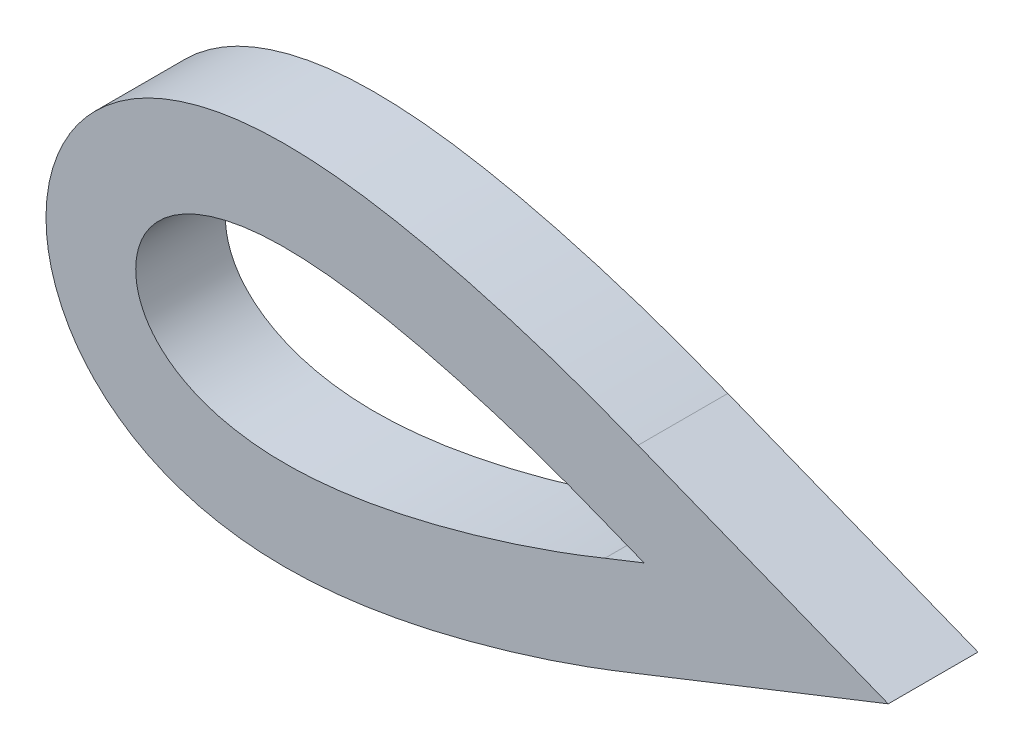
ISO-10303-21;
HEADER;
FILE_DESCRIPTION(('STEP AP214'),'2;1');
FILE_NAME('part.step','',(''),(''),'','','');
FILE_SCHEMA(('AUTOMOTIVE_DESIGN { 1 0 10303 214 1 1 1 1 }'));
ENDSEC;
DATA;
#1=APPLICATION_CONTEXT('core data for automotive mechanical design processes');
#2=APPLICATION_PROTOCOL_DEFINITION('international standard','automotive_design',2000,#1);
#3=PRODUCT_CONTEXT('',#1,'mechanical');
#4=PRODUCT('Part','Part','',(#3));
#5=PRODUCT_RELATED_PRODUCT_CATEGORY('part','',(#4));
#6=PRODUCT_DEFINITION_FORMATION('','',#4);
#7=PRODUCT_DEFINITION_CONTEXT('part definition',#1,'design');
#8=PRODUCT_DEFINITION('design','',#6,#7);
#9=PRODUCT_DEFINITION_SHAPE('','',#8);
#10=(LENGTH_UNIT() NAMED_UNIT(*) SI_UNIT(.MILLI.,.METRE.));
#11=(NAMED_UNIT(*) PLANE_ANGLE_UNIT() SI_UNIT($,.RADIAN.));
#12=(NAMED_UNIT(*) SI_UNIT($,.STERADIAN.) SOLID_ANGLE_UNIT());
#13=UNCERTAINTY_MEASURE_WITH_UNIT(LENGTH_MEASURE(1.E-05),#10,'distance_accuracy_value','');
#14=(GEOMETRIC_REPRESENTATION_CONTEXT(3) GLOBAL_UNCERTAINTY_ASSIGNED_CONTEXT((#13)) GLOBAL_UNIT_ASSIGNED_CONTEXT((#10,
#11,#12)) REPRESENTATION_CONTEXT('',''));
#15=CARTESIAN_POINT('',(0.,0.,0.));
#16=DIRECTION('',(0.,0.,1.));
#17=DIRECTION('',(1.,0.,0.));
#18=AXIS2_PLACEMENT_3D('',#15,#16,#17);
#19=CARTESIAN_POINT('',(-3.5,-2.80970992999618E-13,3.));
#20=DIRECTION('',(0.,0.,-1.));
#21=DIRECTION('',(-1.,0.,0.));
#22=AXIS2_PLACEMENT_3D('',#19,#20,#21);
#23=PLANE('',#22);
#24=CARTESIAN_POINT('',(16.2965398197559,3.30630723662,3.));
#25=CARTESIAN_POINT('',(15.6062531924938,3.58341900975374,3.));
#26=CARTESIAN_POINT('',(14.217393724142,4.1140687673244,3.));
#27=CARTESIAN_POINT('',(12.0871832129093,4.80366662805242,3.));
#28=CARTESIAN_POINT('',(9.91285023013423,5.39990504431122,3.));
#29=CARTESIAN_POINT('',(7.6390085054452,5.88049465242059,3.));
#30=CARTESIAN_POINT('',(5.57935945867602,6.12862814503999,3.));
#31=CARTESIAN_POINT('',(3.7684941194776,6.13276148095437,3.));
#32=CARTESIAN_POINT('',(2.30563580419767,5.98016909192922,3.));
#33=CARTESIAN_POINT('',(0.698738216382123,5.57222010036538,3.));
#34=CARTESIAN_POINT('',(-0.754528622780674,4.87235654903361,3.));
#35=CARTESIAN_POINT('',(-1.94046110921141,3.87862721868725,3.));
#36=CARTESIAN_POINT('',(-2.75980650550251,2.85449296540342,3.));
#37=CARTESIAN_POINT('',(-3.36876812159803,1.4729306089841,3.));
#38=CARTESIAN_POINT('',(-3.56561593920102,-2.85904112884428E-13,3.));
#39=CARTESIAN_POINT('',(-3.36876812159788,-1.47293060898463,3.));
#40=CARTESIAN_POINT('',(-2.75980650550221,-2.8544929654039,3.));
#41=CARTESIAN_POINT('',(-1.94046110921108,-3.87862721868758,3.));
#42=CARTESIAN_POINT('',(-0.75452862278034,-4.87235654903381,3.));
#43=CARTESIAN_POINT('',(0.698738216382431,-5.57222010036549,3.));
#44=CARTESIAN_POINT('',(2.30563580419797,-5.98016909192928,3.));
#45=CARTESIAN_POINT('',(3.76849411947788,-6.13276148095437,3.));
#46=CARTESIAN_POINT('',(5.57935945867628,-6.12862814503997,3.));
#47=CARTESIAN_POINT('',(7.63900850544543,-5.88049465242055,3.));
#48=CARTESIAN_POINT('',(9.91285023013448,-5.39990504431116,3.));
#49=CARTESIAN_POINT('',(12.0871832129095,-4.80366662805236,3.));
#50=CARTESIAN_POINT('',(14.2173937241423,-4.11406876732431,3.));
#51=CARTESIAN_POINT('',(15.606253192494,-3.58341900975364,3.));
#52=CARTESIAN_POINT('',(16.2965398197561,-3.30630723661991,3.));
#53=B_SPLINE_CURVE_WITH_KNOTS('',3,(#24,#25,#26,#27,#28,#29,#30,#31,#32,#33,#34,#35,#36,#37,#38,
#39,#40,#41,#42,#43,#44,#45,#46,#47,#48,#49,#50,#51,#52),.UNSPECIFIED.,.F.,.F.,(4,1,1,1,1,1,1,1,
1,1,1,1,1,1,1,1,1,1,1,1,1,1,1,1,1,1,4),(0.000239228154699365,0.0627093246353624,
0.125179421116026,0.187649517596689,0.250119614077352,0.312589710558015,0.343824758798346,
0.375059807038678,0.406294855279009,0.437529903519341,0.453147427639507,0.468764951759672,
0.484382475879838,0.500000000000004,0.51561752412017,0.531235048240336,0.546852572360501,
0.562470096480667,0.593705144720999,0.62494019296133,0.656175241201662,0.687410289441993,
0.749880385922656,0.812350482403319,0.874820578883982,0.937290675364645,0.999760771845309),.UNSPECIFIED.);
#54=CARTESIAN_POINT('',(16.2965398197559,3.30630723662,3.));
#55=VERTEX_POINT('',#54);
#56=CARTESIAN_POINT('',(16.2965398197561,-3.30630723661991,3.));
#57=VERTEX_POINT('',#56);
#58=EDGE_CURVE('E144',#55,#57,#53,.T.);
#59=ORIENTED_EDGE('',*,*,#58,.T.);
#60=DIRECTION('',(0.929978538913319,0.367613815247263,0.));
#61=VECTOR('',#60,1.);
#62=CARTESIAN_POINT('',(16.2965398197561,-3.30630723661991,3.));
#63=LINE('',#62,#61);
#64=CARTESIAN_POINT('',(24.6607379145479,0.,3.));
#65=VERTEX_POINT('',#64);
#66=EDGE_CURVE('E146',#57,#65,#63,.T.);
#67=ORIENTED_EDGE('',*,*,#66,.T.);
#68=DIRECTION('',(-0.929978538913319,0.367613815247262,0.));
#69=VECTOR('',#68,1.);
#70=CARTESIAN_POINT('',(24.6607379145479,0.,3.));
#71=LINE('',#70,#69);
#72=EDGE_CURVE('E149',#65,#55,#71,.T.);
#73=ORIENTED_EDGE('',*,*,#72,.T.);
#74=EDGE_LOOP('',(#59,#67,#73));
#75=FACE_BOUND('',#74,.T.);
#76=DIRECTION('',(-0.929978538913317,0.367613815247268,0.));
#77=VECTOR('',#76,1.);
#78=CARTESIAN_POINT('',(16.5,0.,3.));
#79=LINE('',#78,#77);
#80=CARTESIAN_POINT('',(16.5,0.,3.));
#81=VERTEX_POINT('',#80);
#82=CARTESIAN_POINT('',(15.1862806090129,0.519303808934546,3.));
#83=VERTEX_POINT('',#82);
#84=EDGE_CURVE('E91',#81,#83,#79,.T.);
#85=ORIENTED_EDGE('',*,*,#84,.F.);
#86=DIRECTION('',(0.929978538913317,0.367613815247268,0.));
#87=VECTOR('',#86,1.);
#88=CARTESIAN_POINT('',(15.1862806090129,-0.519303808934546,3.));
#89=LINE('',#88,#87);
#90=CARTESIAN_POINT('',(15.1862806090129,-0.519303808934545,3.));
#91=VERTEX_POINT('',#90);
#92=EDGE_CURVE('E110',#91,#81,#89,.T.);
#93=ORIENTED_EDGE('',*,*,#92,.F.);
#94=CARTESIAN_POINT('',(15.1862806090129,0.519303808934546,3.));
#95=CARTESIAN_POINT('',(14.8650206194113,0.648277979754169,3.));
#96=CARTESIAN_POINT('',(14.539250739613,0.778688361108065,3.));
#97=CARTESIAN_POINT('',(13.8827086575689,1.02768802558437,3.));
#98=CARTESIAN_POINT('',(13.5537735067603,1.14713971331855,3.));
#99=CARTESIAN_POINT('',(12.5627813043648,1.49483318235808,3.));
#100=CARTESIAN_POINT('',(11.8970000847065,1.71138735051519,3.));
#101=CARTESIAN_POINT('',(10.5549684537933,2.11296128526281,3.));
#102=CARTESIAN_POINT('',(9.87875965596575,2.29827174548746,3.));
#103=CARTESIAN_POINT('',(8.51314140812534,2.62874959831997,3.));
#104=CARTESIAN_POINT('',(7.82370052196218,2.77422721177081,3.));
#105=CARTESIAN_POINT('',(6.42621220326752,3.00346627347297,3.));
#106=CARTESIAN_POINT('',(5.71750211261015,3.08736040177966,3.));
#107=CARTESIAN_POINT('',(4.2801839068293,3.14391225286255,3.));
#108=CARTESIAN_POINT('',(3.54976898647691,3.11868687194168,3.));
#109=CARTESIAN_POINT('',(2.45510526217817,2.92012132403685,3.));
#110=CARTESIAN_POINT('',(2.08950554161524,2.82631567384382,3.));
#111=CARTESIAN_POINT('',(1.3734442479303,2.55784012072214,3.));
#112=CARTESIAN_POINT('',(1.02271793727582,2.38458302436317,3.));
#113=CARTESIAN_POINT('',(0.370973090884393,1.91727432292788,3.));
#114=CARTESIAN_POINT('',(0.0700749492748268,1.62196491159413,3.));
#115=CARTESIAN_POINT('',(-0.262454460602873,1.06780053335674,3.));
#116=CARTESIAN_POINT('',(-0.351329952757429,0.863359623717835,3.));
#117=CARTESIAN_POINT('',(-0.469181936021409,0.440955488182629,3.));
#118=CARTESIAN_POINT('',(-0.499999999999999,0.221471168062717,3.));
#119=CARTESIAN_POINT('',(-0.500000000000001,-0.221471168062696,3.));
#120=CARTESIAN_POINT('',(-0.469181936021414,-0.440955488182609,3.));
#121=CARTESIAN_POINT('',(-0.351329952757437,-0.863359623717816,3.));
#122=CARTESIAN_POINT('',(-0.262454460602882,-1.06780053335672,3.));
#123=CARTESIAN_POINT('',(0.0700749492748169,-1.62196491159412,3.));
#124=CARTESIAN_POINT('',(0.370973090884383,-1.91727432292787,3.));
#125=CARTESIAN_POINT('',(1.02271793727581,-2.38458302436317,3.));
#126=CARTESIAN_POINT('',(1.37344424793028,-2.55784012072213,3.));
#127=CARTESIAN_POINT('',(2.08950554161523,-2.82631567384382,3.));
#128=CARTESIAN_POINT('',(2.45510526217816,-2.92012132403685,3.));
#129=CARTESIAN_POINT('',(3.5497689864769,-3.11868687194168,3.));
#130=CARTESIAN_POINT('',(4.28018390682928,-3.14391225286255,3.));
#131=CARTESIAN_POINT('',(5.71750211261014,-3.08736040177966,3.));
#132=CARTESIAN_POINT('',(6.42621220326751,-3.00346627347297,3.));
#133=CARTESIAN_POINT('',(7.82370052196217,-2.77422721177081,3.));
#134=CARTESIAN_POINT('',(8.51314140812533,-2.62874959831997,3.));
#135=CARTESIAN_POINT('',(9.87875965596574,-2.29827174548746,3.));
#136=CARTESIAN_POINT('',(10.5549684537933,-2.11296128526281,3.));
#137=CARTESIAN_POINT('',(11.8970000847065,-1.71138735051519,3.));
#138=CARTESIAN_POINT('',(12.5627813043648,-1.49483318235808,3.));
#139=CARTESIAN_POINT('',(13.5537735067602,-1.14713971331855,3.));
#140=CARTESIAN_POINT('',(13.8827086575689,-1.02768802558437,3.));
#141=CARTESIAN_POINT('',(14.539250739613,-0.778688361108061,3.));
#142=CARTESIAN_POINT('',(14.8650206194113,-0.648277979754169,3.));
#143=CARTESIAN_POINT('',(15.1862806090129,-0.519303808934549,3.));
#144=B_SPLINE_CURVE_WITH_KNOTS('',3,(#94,#95,#96,#97,#98,#99,#100,#101,#102,#103,#104,#105,#106,
#107,#108,#109,#110,#111,#112,#113,#114,#115,#116,#117,#118,#119,#120,#121,#122,#123,#124,#125,
#126,#127,#128,#129,#130,#131,#132,#133,#134,#135,#136,#137,#138,#139,#140,#141,#142,#143),
.UNSPECIFIED.,.F.,.F.,(4,2,2,2,2,2,2,2,2,2,2,2,2,2,2,2,2,2,2,2,2,2,2,2,4),(0.,
0.0312500000000001,0.0625000000000002,0.125,0.1875,0.250000000000001,0.312500000000001,
0.375000000000001,0.406250000000001,0.437500000000001,0.468750000000001,0.484375000000001,
0.500000000000001,0.515625000000001,0.531250000000001,0.562500000000001,0.593750000000001,
0.625000000000001,0.687500000000001,0.750000000000001,0.812500000000001,0.875,0.9375,0.96875,
1.),.UNSPECIFIED.);
#145=EDGE_CURVE('E99',#83,#91,#144,.T.);
#146=ORIENTED_EDGE('',*,*,#145,.F.);
#147=EDGE_LOOP('',(#85,#93,#146));
#148=FACE_BOUND('',#147,.T.);
#149=ADVANCED_FACE('F33',(#75,#148),#23,.F.);
#150=CARTESIAN_POINT('',(-3.5,-2.80970992999618E-13,0.));
#151=DIRECTION('',(0.,0.,-1.));
#152=DIRECTION('',(-1.,0.,0.));
#153=AXIS2_PLACEMENT_3D('',#150,#151,#152);
#154=PLANE('',#153);
#155=CARTESIAN_POINT('',(16.2965398197559,3.30630723662,0.));
#156=CARTESIAN_POINT('',(15.6062531924938,3.58341900975374,0.));
#157=CARTESIAN_POINT('',(14.217393724142,4.1140687673244,0.));
#158=CARTESIAN_POINT('',(12.0871832129093,4.80366662805242,0.));
#159=CARTESIAN_POINT('',(9.91285023013423,5.39990504431122,0.));
#160=CARTESIAN_POINT('',(7.6390085054452,5.88049465242059,0.));
#161=CARTESIAN_POINT('',(5.57935945867602,6.12862814503999,0.));
#162=CARTESIAN_POINT('',(3.7684941194776,6.13276148095437,0.));
#163=CARTESIAN_POINT('',(2.30563580419767,5.98016909192922,0.));
#164=CARTESIAN_POINT('',(0.698738216382123,5.57222010036538,0.));
#165=CARTESIAN_POINT('',(-0.754528622780674,4.87235654903361,0.));
#166=CARTESIAN_POINT('',(-1.94046110921141,3.87862721868725,0.));
#167=CARTESIAN_POINT('',(-2.75980650550251,2.85449296540342,0.));
#168=CARTESIAN_POINT('',(-3.36876812159803,1.4729306089841,0.));
#169=CARTESIAN_POINT('',(-3.56561593920102,-2.85904112884428E-13,0.));
#170=CARTESIAN_POINT('',(-3.36876812159788,-1.47293060898463,0.));
#171=CARTESIAN_POINT('',(-2.75980650550221,-2.8544929654039,0.));
#172=CARTESIAN_POINT('',(-1.94046110921108,-3.87862721868758,0.));
#173=CARTESIAN_POINT('',(-0.75452862278034,-4.87235654903381,0.));
#174=CARTESIAN_POINT('',(0.698738216382431,-5.57222010036549,0.));
#175=CARTESIAN_POINT('',(2.30563580419797,-5.98016909192928,0.));
#176=CARTESIAN_POINT('',(3.76849411947788,-6.13276148095437,0.));
#177=CARTESIAN_POINT('',(5.57935945867628,-6.12862814503997,0.));
#178=CARTESIAN_POINT('',(7.63900850544543,-5.88049465242055,0.));
#179=CARTESIAN_POINT('',(9.91285023013448,-5.39990504431116,0.));
#180=CARTESIAN_POINT('',(12.0871832129095,-4.80366662805236,0.));
#181=CARTESIAN_POINT('',(14.2173937241423,-4.11406876732431,0.));
#182=CARTESIAN_POINT('',(15.606253192494,-3.58341900975364,0.));
#183=CARTESIAN_POINT('',(16.2965398197561,-3.30630723661991,0.));
#184=B_SPLINE_CURVE_WITH_KNOTS('',3,(#155,#156,#157,#158,#159,#160,#161,#162,#163,#164,#165,
#166,#167,#168,#169,#170,#171,#172,#173,#174,#175,#176,#177,#178,#179,#180,#181,#182,#183),
.UNSPECIFIED.,.F.,.F.,(4,1,1,1,1,1,1,1,1,1,1,1,1,1,1,1,1,1,1,1,1,1,1,1,1,1,4),
(0.000239228154699365,0.0627093246353624,0.125179421116026,0.187649517596689,0.250119614077352,
0.312589710558015,0.343824758798346,0.375059807038678,0.406294855279009,0.437529903519341,
0.453147427639507,0.468764951759672,0.484382475879838,0.500000000000004,0.51561752412017,
0.531235048240336,0.546852572360501,0.562470096480667,0.593705144720999,0.62494019296133,
0.656175241201662,0.687410289441993,0.749880385922656,0.812350482403319,0.874820578883982,
0.937290675364645,0.999760771845309),.UNSPECIFIED.);
#185=CARTESIAN_POINT('',(16.2965398197559,3.30630723662,0.));
#186=VERTEX_POINT('',#185);
#187=CARTESIAN_POINT('',(16.2965398197561,-3.30630723661991,0.));
#188=VERTEX_POINT('',#187);
#189=EDGE_CURVE('E108',#186,#188,#184,.T.);
#190=ORIENTED_EDGE('',*,*,#189,.F.);
#191=DIRECTION('',(-0.929978538913319,0.367613815247262,0.));
#192=VECTOR('',#191,1.);
#193=CARTESIAN_POINT('',(24.6607379145479,0.,0.));
#194=LINE('',#193,#192);
#195=CARTESIAN_POINT('',(24.6607379145479,0.,0.));
#196=VERTEX_POINT('',#195);
#197=EDGE_CURVE('E152',#196,#186,#194,.T.);
#198=ORIENTED_EDGE('',*,*,#197,.F.);
#199=DIRECTION('',(0.929978538913319,0.367613815247263,0.));
#200=VECTOR('',#199,1.);
#201=CARTESIAN_POINT('',(16.2965398197561,-3.30630723661991,0.));
#202=LINE('',#201,#200);
#203=EDGE_CURVE('E155',#188,#196,#202,.T.);
#204=ORIENTED_EDGE('',*,*,#203,.F.);
#205=EDGE_LOOP('',(#190,#198,#204));
#206=FACE_BOUND('',#205,.T.);
#207=DIRECTION('',(0.929978538913317,0.367613815247268,0.));
#208=VECTOR('',#207,1.);
#209=CARTESIAN_POINT('',(15.1862806090129,-0.519303808934546,0.));
#210=LINE('',#209,#208);
#211=CARTESIAN_POINT('',(15.1862806090129,-0.519303808934546,0.));
#212=VERTEX_POINT('',#211);
#213=CARTESIAN_POINT('',(16.5,0.,0.));
#214=VERTEX_POINT('',#213);
#215=EDGE_CURVE('E100',#212,#214,#210,.T.);
#216=ORIENTED_EDGE('',*,*,#215,.T.);
#217=DIRECTION('',(-0.929978538913317,0.367613815247268,0.));
#218=VECTOR('',#217,1.);
#219=CARTESIAN_POINT('',(16.5,0.,0.));
#220=LINE('',#219,#218);
#221=CARTESIAN_POINT('',(15.1862806090129,0.519303808934546,0.));
#222=VERTEX_POINT('',#221);
#223=EDGE_CURVE('E61',#214,#222,#220,.T.);
#224=ORIENTED_EDGE('',*,*,#223,.T.);
#225=CARTESIAN_POINT('',(15.1862806090129,-0.519303808934549,0.));
#226=CARTESIAN_POINT('',(14.8650206194113,-0.648277979754169,0.));
#227=CARTESIAN_POINT('',(14.539250739613,-0.778688361108061,0.));
#228=CARTESIAN_POINT('',(13.8827086575689,-1.02768802558437,0.));
#229=CARTESIAN_POINT('',(13.5537735067602,-1.14713971331855,0.));
#230=CARTESIAN_POINT('',(12.5627813043648,-1.49483318235808,0.));
#231=CARTESIAN_POINT('',(11.8970000847065,-1.71138735051519,0.));
#232=CARTESIAN_POINT('',(10.5549684537933,-2.11296128526281,0.));
#233=CARTESIAN_POINT('',(9.87875965596574,-2.29827174548746,0.));
#234=CARTESIAN_POINT('',(8.51314140812533,-2.62874959831997,0.));
#235=CARTESIAN_POINT('',(7.82370052196217,-2.77422721177081,0.));
#236=CARTESIAN_POINT('',(6.42621220326751,-3.00346627347297,0.));
#237=CARTESIAN_POINT('',(5.71750211261014,-3.08736040177966,0.));
#238=CARTESIAN_POINT('',(4.28018390682928,-3.14391225286255,0.));
#239=CARTESIAN_POINT('',(3.5497689864769,-3.11868687194168,0.));
#240=CARTESIAN_POINT('',(2.45510526217816,-2.92012132403685,0.));
#241=CARTESIAN_POINT('',(2.08950554161523,-2.82631567384382,0.));
#242=CARTESIAN_POINT('',(1.37344424793028,-2.55784012072213,0.));
#243=CARTESIAN_POINT('',(1.02271793727581,-2.38458302436317,0.));
#244=CARTESIAN_POINT('',(0.370973090884383,-1.91727432292787,0.));
#245=CARTESIAN_POINT('',(0.0700749492748169,-1.62196491159412,0.));
#246=CARTESIAN_POINT('',(-0.262454460602882,-1.06780053335672,0.));
#247=CARTESIAN_POINT('',(-0.351329952757437,-0.863359623717816,0.));
#248=CARTESIAN_POINT('',(-0.469181936021414,-0.440955488182609,0.));
#249=CARTESIAN_POINT('',(-0.500000000000001,-0.221471168062696,0.));
#250=CARTESIAN_POINT('',(-0.499999999999999,0.221471168062717,0.));
#251=CARTESIAN_POINT('',(-0.469181936021409,0.440955488182629,0.));
#252=CARTESIAN_POINT('',(-0.351329952757429,0.863359623717835,0.));
#253=CARTESIAN_POINT('',(-0.262454460602873,1.06780053335674,0.));
#254=CARTESIAN_POINT('',(0.0700749492748268,1.62196491159413,0.));
#255=CARTESIAN_POINT('',(0.370973090884393,1.91727432292788,0.));
#256=CARTESIAN_POINT('',(1.02271793727582,2.38458302436317,0.));
#257=CARTESIAN_POINT('',(1.3734442479303,2.55784012072214,0.));
#258=CARTESIAN_POINT('',(2.08950554161524,2.82631567384382,0.));
#259=CARTESIAN_POINT('',(2.45510526217817,2.92012132403685,0.));
#260=CARTESIAN_POINT('',(3.54976898647691,3.11868687194168,0.));
#261=CARTESIAN_POINT('',(4.2801839068293,3.14391225286255,0.));
#262=CARTESIAN_POINT('',(5.71750211261015,3.08736040177966,0.));
#263=CARTESIAN_POINT('',(6.42621220326752,3.00346627347297,0.));
#264=CARTESIAN_POINT('',(7.82370052196218,2.77422721177081,0.));
#265=CARTESIAN_POINT('',(8.51314140812534,2.62874959831997,0.));
#266=CARTESIAN_POINT('',(9.87875965596575,2.29827174548746,0.));
#267=CARTESIAN_POINT('',(10.5549684537933,2.11296128526281,0.));
#268=CARTESIAN_POINT('',(11.8970000847065,1.71138735051519,0.));
#269=CARTESIAN_POINT('',(12.5627813043648,1.49483318235808,0.));
#270=CARTESIAN_POINT('',(13.5537735067603,1.14713971331855,0.));
#271=CARTESIAN_POINT('',(13.8827086575689,1.02768802558437,0.));
#272=CARTESIAN_POINT('',(14.539250739613,0.778688361108065,0.));
#273=CARTESIAN_POINT('',(14.8650206194113,0.648277979754169,0.));
#274=CARTESIAN_POINT('',(15.1862806090129,0.519303808934546,0.));
#275=B_SPLINE_CURVE_WITH_KNOTS('',3,(#225,#226,#227,#228,#229,#230,#231,#232,#233,#234,#235,
#236,#237,#238,#239,#240,#241,#242,#243,#244,#245,#246,#247,#248,#249,#250,#251,#252,#253,#254,
#255,#256,#257,#258,#259,#260,#261,#262,#263,#264,#265,#266,#267,#268,#269,#270,#271,#272,#273,
#274),.UNSPECIFIED.,.F.,.F.,(4,2,2,2,2,2,2,2,2,2,2,2,2,2,2,2,2,2,2,2,2,2,2,2,4),(0.,
0.0312499999999998,0.0624999999999996,0.125,0.187499999999999,0.249999999999999,
0.312499999999999,0.374999999999999,0.406249999999999,0.437499999999999,0.468749999999999,
0.484374999999999,0.499999999999999,0.515624999999999,0.531249999999999,0.562499999999999,
0.593749999999999,0.624999999999999,0.687499999999999,0.749999999999999,0.8125,0.875,0.9375,
0.96875,1.),.UNSPECIFIED.);
#276=EDGE_CURVE('E106',#222,#212,#275,.F.);
#277=ORIENTED_EDGE('',*,*,#276,.T.);
#278=EDGE_LOOP('',(#216,#224,#277));
#279=FACE_BOUND('',#278,.T.);
#280=ADVANCED_FACE('F116',(#206,#279),#154,.T.);
#281=DIRECTION('',(0.,0.,-1.));
#282=VECTOR('',#281,1.);
#283=SURFACE_OF_LINEAR_EXTRUSION('',#53,#282);
#284=ORIENTED_EDGE('',*,*,#189,.T.);
#285=DIRECTION('',(0.,0.,-1.));
#286=VECTOR('',#285,1.);
#287=CARTESIAN_POINT('',(16.2965398197561,-3.30630723661991,3.));
#288=LINE('',#287,#286);
#289=EDGE_CURVE('E11',#57,#188,#288,.T.);
#290=ORIENTED_EDGE('',*,*,#289,.F.);
#291=ORIENTED_EDGE('',*,*,#58,.F.);
#292=DIRECTION('',(0.,0.,-1.));
#293=VECTOR('',#292,1.);
#294=CARTESIAN_POINT('',(16.2965398197559,3.30630723662,3.));
#295=LINE('',#294,#293);
#296=EDGE_CURVE('E158',#55,#186,#295,.T.);
#297=ORIENTED_EDGE('',*,*,#296,.T.);
#298=EDGE_LOOP('',(#284,#290,#291,#297));
#299=FACE_BOUND('',#298,.T.);
#300=ADVANCED_FACE('F35',(#299),#283,.F.);
#301=CARTESIAN_POINT('',(16.2965398197561,-3.30630723661991,3.));
#302=DIRECTION('',(-0.367613815247263,0.929978538913319,0.));
#303=DIRECTION('',(-0.929978538913319,-0.367613815247263,0.));
#304=AXIS2_PLACEMENT_3D('',#301,#302,#303);
#305=PLANE('',#304);
#306=ORIENTED_EDGE('',*,*,#203,.T.);
#307=DIRECTION('',(0.,0.,-1.));
#308=VECTOR('',#307,1.);
#309=CARTESIAN_POINT('',(24.6607379145479,0.,3.));
#310=LINE('',#309,#308);
#311=EDGE_CURVE('E45',#65,#196,#310,.T.);
#312=ORIENTED_EDGE('',*,*,#311,.F.);
#313=ORIENTED_EDGE('',*,*,#66,.F.);
#314=ORIENTED_EDGE('',*,*,#289,.T.);
#315=EDGE_LOOP('',(#306,#312,#313,#314));
#316=FACE_BOUND('',#315,.T.);
#317=ADVANCED_FACE('F130',(#316),#305,.F.);
#318=CARTESIAN_POINT('',(24.6607379145479,0.,3.));
#319=DIRECTION('',(-0.367613815247262,-0.929978538913319,0.));
#320=DIRECTION('',(0.929978538913319,-0.367613815247262,0.));
#321=AXIS2_PLACEMENT_3D('',#318,#319,#320);
#322=PLANE('',#321);
#323=ORIENTED_EDGE('',*,*,#197,.T.);
#324=ORIENTED_EDGE('',*,*,#296,.F.);
#325=ORIENTED_EDGE('',*,*,#72,.F.);
#326=ORIENTED_EDGE('',*,*,#311,.T.);
#327=EDGE_LOOP('',(#323,#324,#325,#326));
#328=FACE_BOUND('',#327,.T.);
#329=ADVANCED_FACE('F128',(#328),#322,.F.);
#330=CARTESIAN_POINT('',(16.5,0.,3.));
#331=DIRECTION('',(-0.367613815247268,-0.929978538913317,0.));
#332=DIRECTION('',(0.929978538913317,-0.367613815247268,0.));
#333=AXIS2_PLACEMENT_3D('',#330,#331,#332);
#334=PLANE('',#333);
#335=ORIENTED_EDGE('',*,*,#223,.F.);
#336=DIRECTION('',(0.,0.,-1.));
#337=VECTOR('',#336,1.);
#338=CARTESIAN_POINT('',(16.5,0.,3.));
#339=LINE('',#338,#337);
#340=EDGE_CURVE('E95',#81,#214,#339,.T.);
#341=ORIENTED_EDGE('',*,*,#340,.F.);
#342=ORIENTED_EDGE('',*,*,#84,.T.);
#343=DIRECTION('',(0.,0.,-1.));
#344=VECTOR('',#343,1.);
#345=CARTESIAN_POINT('',(15.1862806090129,0.519303808934546,3.));
#346=LINE('',#345,#344);
#347=EDGE_CURVE('E94',#83,#222,#346,.T.);
#348=ORIENTED_EDGE('',*,*,#347,.T.);
#349=EDGE_LOOP('',(#335,#341,#342,#348));
#350=FACE_BOUND('',#349,.T.);
#351=ADVANCED_FACE('F93',(#350),#334,.T.);
#352=CARTESIAN_POINT('',(15.1862806090129,0.519303808934546,3.));
#353=CARTESIAN_POINT('',(14.8650206194113,0.648277979754169,3.));
#354=CARTESIAN_POINT('',(14.539250739613,0.778688361108065,3.));
#355=CARTESIAN_POINT('',(13.8827086575689,1.02768802558437,3.));
#356=CARTESIAN_POINT('',(13.5537735067603,1.14713971331855,3.));
#357=CARTESIAN_POINT('',(12.5627813043648,1.49483318235808,3.));
#358=CARTESIAN_POINT('',(11.8970000847065,1.71138735051519,3.));
#359=CARTESIAN_POINT('',(10.5549684537933,2.11296128526281,3.));
#360=CARTESIAN_POINT('',(9.87875965596575,2.29827174548746,3.));
#361=CARTESIAN_POINT('',(8.51314140812534,2.62874959831997,3.));
#362=CARTESIAN_POINT('',(7.82370052196218,2.77422721177081,3.));
#363=CARTESIAN_POINT('',(6.42621220326752,3.00346627347297,3.));
#364=CARTESIAN_POINT('',(5.71750211261015,3.08736040177966,3.));
#365=CARTESIAN_POINT('',(4.2801839068293,3.14391225286255,3.));
#366=CARTESIAN_POINT('',(3.54976898647691,3.11868687194168,3.));
#367=CARTESIAN_POINT('',(2.45510526217817,2.92012132403685,3.));
#368=CARTESIAN_POINT('',(2.08950554161524,2.82631567384382,3.));
#369=CARTESIAN_POINT('',(1.3734442479303,2.55784012072214,3.));
#370=CARTESIAN_POINT('',(1.02271793727582,2.38458302436317,3.));
#371=CARTESIAN_POINT('',(0.370973090884393,1.91727432292788,3.));
#372=CARTESIAN_POINT('',(0.0700749492748268,1.62196491159413,3.));
#373=CARTESIAN_POINT('',(-0.262454460602873,1.06780053335674,3.));
#374=CARTESIAN_POINT('',(-0.351329952757429,0.863359623717835,3.));
#375=CARTESIAN_POINT('',(-0.469181936021409,0.440955488182629,3.));
#376=CARTESIAN_POINT('',(-0.499999999999999,0.221471168062717,3.));
#377=CARTESIAN_POINT('',(-0.500000000000001,-0.221471168062696,3.));
#378=CARTESIAN_POINT('',(-0.469181936021414,-0.440955488182609,3.));
#379=CARTESIAN_POINT('',(-0.351329952757437,-0.863359623717816,3.));
#380=CARTESIAN_POINT('',(-0.262454460602882,-1.06780053335672,3.));
#381=CARTESIAN_POINT('',(0.0700749492748169,-1.62196491159412,3.));
#382=CARTESIAN_POINT('',(0.370973090884383,-1.91727432292787,3.));
#383=CARTESIAN_POINT('',(1.02271793727581,-2.38458302436317,3.));
#384=CARTESIAN_POINT('',(1.37344424793028,-2.55784012072213,3.));
#385=CARTESIAN_POINT('',(2.08950554161523,-2.82631567384382,3.));
#386=CARTESIAN_POINT('',(2.45510526217816,-2.92012132403685,3.));
#387=CARTESIAN_POINT('',(3.5497689864769,-3.11868687194168,3.));
#388=CARTESIAN_POINT('',(4.28018390682928,-3.14391225286255,3.));
#389=CARTESIAN_POINT('',(5.71750211261014,-3.08736040177966,3.));
#390=CARTESIAN_POINT('',(6.42621220326751,-3.00346627347297,3.));
#391=CARTESIAN_POINT('',(7.82370052196217,-2.77422721177081,3.));
#392=CARTESIAN_POINT('',(8.51314140812533,-2.62874959831997,3.));
#393=CARTESIAN_POINT('',(9.87875965596574,-2.29827174548746,3.));
#394=CARTESIAN_POINT('',(10.5549684537933,-2.11296128526281,3.));
#395=CARTESIAN_POINT('',(11.8970000847065,-1.71138735051519,3.));
#396=CARTESIAN_POINT('',(12.5627813043648,-1.49483318235808,3.));
#397=CARTESIAN_POINT('',(13.5537735067602,-1.14713971331855,3.));
#398=CARTESIAN_POINT('',(13.8827086575689,-1.02768802558437,3.));
#399=CARTESIAN_POINT('',(14.539250739613,-0.778688361108061,3.));
#400=CARTESIAN_POINT('',(14.8650206194113,-0.648277979754169,3.));
#401=CARTESIAN_POINT('',(15.1862806090129,-0.519303808934549,3.));
#402=B_SPLINE_CURVE_WITH_KNOTS('',3,(#352,#353,#354,#355,#356,#357,#358,#359,#360,#361,#362,
#363,#364,#365,#366,#367,#368,#369,#370,#371,#372,#373,#374,#375,#376,#377,#378,#379,#380,#381,
#382,#383,#384,#385,#386,#387,#388,#389,#390,#391,#392,#393,#394,#395,#396,#397,#398,#399,#400,
#401),.UNSPECIFIED.,.F.,.F.,(4,2,2,2,2,2,2,2,2,2,2,2,2,2,2,2,2,2,2,2,2,2,2,2,4),(0.,
0.0312500000000001,0.0625000000000002,0.125,0.1875,0.250000000000001,0.312500000000001,
0.375000000000001,0.406250000000001,0.437500000000001,0.468750000000001,0.484375000000001,
0.500000000000001,0.515625000000001,0.531250000000001,0.562500000000001,0.593750000000001,
0.625000000000001,0.687500000000001,0.750000000000001,0.812500000000001,0.875,0.9375,0.96875,
1.),.UNSPECIFIED.);
#403=DIRECTION('',(0.,0.,-1.));
#404=VECTOR('',#403,1.);
#405=SURFACE_OF_LINEAR_EXTRUSION('',#402,#404);
#406=ORIENTED_EDGE('',*,*,#276,.F.);
#407=ORIENTED_EDGE('',*,*,#347,.F.);
#408=ORIENTED_EDGE('',*,*,#145,.T.);
#409=DIRECTION('',(0.,0.,-1.));
#410=VECTOR('',#409,1.);
#411=CARTESIAN_POINT('',(15.1862806090129,-0.519303808934546,3.));
#412=LINE('',#411,#410);
#413=EDGE_CURVE('E53',#91,#212,#412,.T.);
#414=ORIENTED_EDGE('',*,*,#413,.T.);
#415=EDGE_LOOP('',(#406,#407,#408,#414));
#416=FACE_BOUND('',#415,.T.);
#417=ADVANCED_FACE('F103',(#416),#405,.T.);
#418=CARTESIAN_POINT('',(15.1862806090129,-0.519303808934546,3.));
#419=DIRECTION('',(-0.367613815247268,0.929978538913317,0.));
#420=DIRECTION('',(-0.929978538913317,-0.367613815247268,0.));
#421=AXIS2_PLACEMENT_3D('',#418,#419,#420);
#422=PLANE('',#421);
#423=ORIENTED_EDGE('',*,*,#215,.F.);
#424=ORIENTED_EDGE('',*,*,#413,.F.);
#425=ORIENTED_EDGE('',*,*,#92,.T.);
#426=ORIENTED_EDGE('',*,*,#340,.T.);
#427=EDGE_LOOP('',(#423,#424,#425,#426));
#428=FACE_BOUND('',#427,.T.);
#429=ADVANCED_FACE('F196',(#428),#422,.T.);
#430=CLOSED_SHELL('',(#149,#280,#300,#317,#329,#351,#417,#429));
#431=MANIFOLD_SOLID_BREP('B2',#430);
#432=ADVANCED_BREP_SHAPE_REPRESENTATION('',(#18,#431),#14);
#433=SHAPE_DEFINITION_REPRESENTATION(#9,#432);
ENDSEC;
END-ISO-10303-21;
